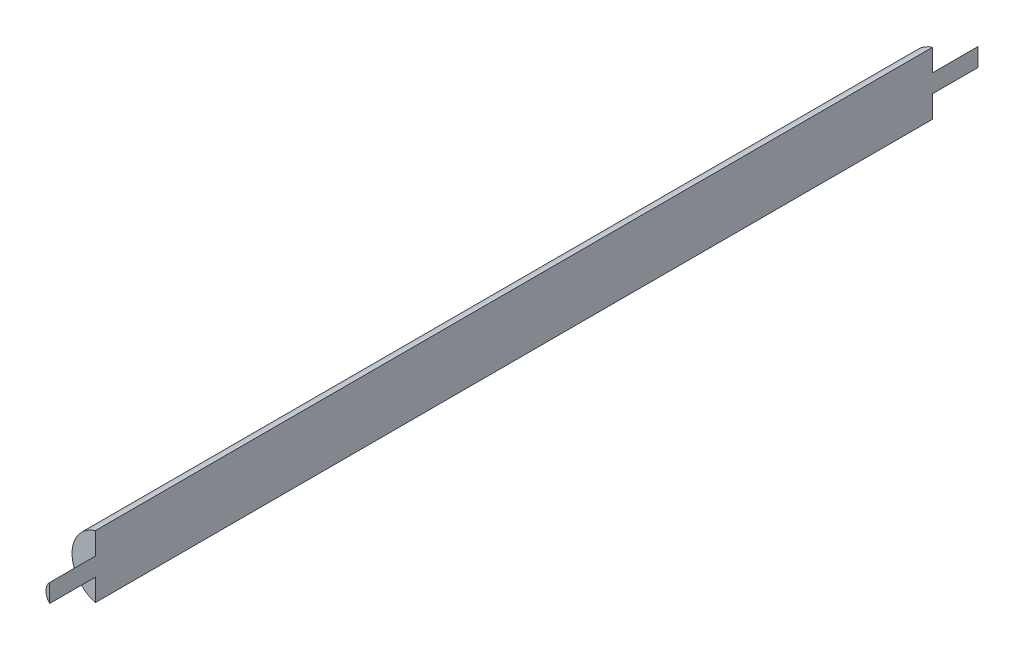
ISO-10303-21;
HEADER;
FILE_DESCRIPTION(('STEP AP214'),'2;1');
FILE_NAME('part.step','',(''),(''),'','','');
FILE_SCHEMA(('AUTOMOTIVE_DESIGN { 1 0 10303 214 1 1 1 1 }'));
ENDSEC;
DATA;
#1=APPLICATION_CONTEXT('core data for automotive mechanical design processes');
#2=APPLICATION_PROTOCOL_DEFINITION('international standard','automotive_design',2000,#1);
#3=PRODUCT_CONTEXT('',#1,'mechanical');
#4=PRODUCT('Part','Part','',(#3));
#5=PRODUCT_RELATED_PRODUCT_CATEGORY('part','',(#4));
#6=PRODUCT_DEFINITION_FORMATION('','',#4);
#7=PRODUCT_DEFINITION_CONTEXT('part definition',#1,'design');
#8=PRODUCT_DEFINITION('design','',#6,#7);
#9=PRODUCT_DEFINITION_SHAPE('','',#8);
#10=(LENGTH_UNIT() NAMED_UNIT(*) SI_UNIT(.MILLI.,.METRE.));
#11=(NAMED_UNIT(*) PLANE_ANGLE_UNIT() SI_UNIT($,.RADIAN.));
#12=(NAMED_UNIT(*) SI_UNIT($,.STERADIAN.) SOLID_ANGLE_UNIT());
#13=UNCERTAINTY_MEASURE_WITH_UNIT(LENGTH_MEASURE(1.E-05),#10,'distance_accuracy_value','');
#14=(GEOMETRIC_REPRESENTATION_CONTEXT(3) GLOBAL_UNCERTAINTY_ASSIGNED_CONTEXT((#13)) GLOBAL_UNIT_ASSIGNED_CONTEXT((#10,
#11,#12)) REPRESENTATION_CONTEXT('',''));
#15=CARTESIAN_POINT('',(0.,0.,0.));
#16=DIRECTION('',(0.,0.,1.));
#17=DIRECTION('',(1.,0.,0.));
#18=AXIS2_PLACEMENT_3D('',#15,#16,#17);
#19=CARTESIAN_POINT('',(0.,0.,90.));
#20=DIRECTION('',(0.,0.,-1.));
#21=DIRECTION('',(-1.,0.,0.));
#22=AXIS2_PLACEMENT_3D('',#19,#20,#21);
#23=CYLINDRICAL_SURFACE('',#22,3.5);
#24=CARTESIAN_POINT('',(0.,0.,90.));
#25=DIRECTION('',(0.,0.,1.));
#26=DIRECTION('',(1.,0.,0.));
#27=AXIS2_PLACEMENT_3D('',#24,#25,#26);
#28=CIRCLE('',#27,3.5);
#29=CARTESIAN_POINT('',(-1.,3.35410196624968,90.));
#30=VERTEX_POINT('',#29);
#31=CARTESIAN_POINT('',(-0.999999999999999,-3.35410196624968,90.));
#32=VERTEX_POINT('',#31);
#33=EDGE_CURVE('E110',#30,#32,#28,.T.);
#34=ORIENTED_EDGE('',*,*,#33,.F.);
#35=DIRECTION('',(0.,0.,-1.));
#36=VECTOR('',#35,1.);
#37=CARTESIAN_POINT('',(-1.,3.35410196624968,90.));
#38=LINE('',#37,#36);
#39=CARTESIAN_POINT('',(-1.,3.35410196624968,0.));
#40=VERTEX_POINT('',#39);
#41=EDGE_CURVE('E116',#30,#40,#38,.T.);
#42=ORIENTED_EDGE('',*,*,#41,.T.);
#43=CARTESIAN_POINT('',(0.,0.,0.));
#44=DIRECTION('',(0.,0.,1.));
#45=DIRECTION('',(1.,0.,0.));
#46=AXIS2_PLACEMENT_3D('',#43,#44,#45);
#47=CIRCLE('',#46,3.5);
#48=CARTESIAN_POINT('',(-0.999999999999999,-3.35410196624968,0.));
#49=VERTEX_POINT('',#48);
#50=EDGE_CURVE('E114',#40,#49,#47,.T.);
#51=ORIENTED_EDGE('',*,*,#50,.T.);
#52=DIRECTION('',(0.,0.,-1.));
#53=VECTOR('',#52,1.);
#54=CARTESIAN_POINT('',(-0.999999999999999,-3.35410196624968,90.));
#55=LINE('',#54,#53);
#56=EDGE_CURVE('E113',#49,#32,#55,.F.);
#57=ORIENTED_EDGE('',*,*,#56,.T.);
#58=EDGE_LOOP('',(#34,#42,#51,#57));
#59=FACE_BOUND('',#58,.T.);
#60=ADVANCED_FACE('F32',(#59),#23,.T.);
#61=CARTESIAN_POINT('',(0.,0.,90.));
#62=DIRECTION('',(0.,0.,1.));
#63=DIRECTION('',(1.,0.,0.));
#64=AXIS2_PLACEMENT_3D('',#61,#62,#63);
#65=PLANE('',#64);
#66=DIRECTION('',(0.,-1.,0.));
#67=VECTOR('',#66,1.);
#68=CARTESIAN_POINT('',(-1.,0.,90.));
#69=LINE('',#68,#67);
#70=CARTESIAN_POINT('',(-1.,0.979795897113271,90.));
#71=VERTEX_POINT('',#70);
#72=EDGE_CURVE('E41',#30,#71,#69,.T.);
#73=ORIENTED_EDGE('',*,*,#72,.F.);
#74=ORIENTED_EDGE('',*,*,#33,.T.);
#75=CARTESIAN_POINT('',(-0.999999999999999,-0.979795897113272,90.));
#76=VERTEX_POINT('',#75);
#77=EDGE_CURVE('E95',#76,#32,#69,.T.);
#78=ORIENTED_EDGE('',*,*,#77,.F.);
#79=CARTESIAN_POINT('',(0.,0.,90.));
#80=DIRECTION('',(0.,0.,1.));
#81=DIRECTION('',(1.,0.,0.));
#82=AXIS2_PLACEMENT_3D('',#79,#80,#81);
#83=CIRCLE('',#82,1.4);
#84=EDGE_CURVE('E106',#71,#76,#83,.T.);
#85=ORIENTED_EDGE('',*,*,#84,.F.);
#86=EDGE_LOOP('',(#73,#74,#78,#85));
#87=FACE_BOUND('',#86,.T.);
#88=ADVANCED_FACE('F137',(#87),#65,.T.);
#89=CARTESIAN_POINT('',(0.,0.,0.));
#90=DIRECTION('',(0.,0.,1.));
#91=DIRECTION('',(1.,0.,0.));
#92=AXIS2_PLACEMENT_3D('',#89,#90,#91);
#93=PLANE('',#92);
#94=ORIENTED_EDGE('',*,*,#50,.F.);
#95=DIRECTION('',(0.,-1.,0.));
#96=VECTOR('',#95,1.);
#97=CARTESIAN_POINT('',(-1.,0.,0.));
#98=LINE('',#97,#96);
#99=CARTESIAN_POINT('',(-1.,0.979795897113271,0.));
#100=VERTEX_POINT('',#99);
#101=EDGE_CURVE('E103',#40,#100,#98,.T.);
#102=ORIENTED_EDGE('',*,*,#101,.T.);
#103=CARTESIAN_POINT('',(0.,0.,0.));
#104=DIRECTION('',(0.,0.,-1.));
#105=DIRECTION('',(-1.,0.,0.));
#106=AXIS2_PLACEMENT_3D('',#103,#104,#105);
#107=CIRCLE('',#106,1.4);
#108=CARTESIAN_POINT('',(-0.999999999999999,-0.979795897113272,0.));
#109=VERTEX_POINT('',#108);
#110=EDGE_CURVE('E89',#109,#100,#107,.T.);
#111=ORIENTED_EDGE('',*,*,#110,.F.);
#112=EDGE_CURVE('E84',#109,#49,#98,.T.);
#113=ORIENTED_EDGE('',*,*,#112,.T.);
#114=EDGE_LOOP('',(#94,#102,#111,#113));
#115=FACE_BOUND('',#114,.T.);
#116=ADVANCED_FACE('F134',(#115),#93,.F.);
#117=CARTESIAN_POINT('',(0.,0.,94.9));
#118=DIRECTION('',(0.,0.,-1.));
#119=DIRECTION('',(-1.,0.,0.));
#120=AXIS2_PLACEMENT_3D('',#117,#118,#119);
#121=CYLINDRICAL_SURFACE('',#120,1.4);
#122=CARTESIAN_POINT('',(0.,0.,94.9));
#123=DIRECTION('',(0.,0.,1.));
#124=DIRECTION('',(1.,0.,0.));
#125=AXIS2_PLACEMENT_3D('',#122,#123,#124);
#126=CIRCLE('',#125,1.4);
#127=CARTESIAN_POINT('',(-1.,0.979795897113271,94.9));
#128=VERTEX_POINT('',#127);
#129=CARTESIAN_POINT('',(-0.999999999999999,-0.979795897113272,94.9));
#130=VERTEX_POINT('',#129);
#131=EDGE_CURVE('E90',#128,#130,#126,.T.);
#132=ORIENTED_EDGE('',*,*,#131,.F.);
#133=DIRECTION('',(0.,0.,-1.));
#134=VECTOR('',#133,1.);
#135=CARTESIAN_POINT('',(-1.,0.979795897113271,94.9));
#136=LINE('',#135,#134);
#137=EDGE_CURVE('E109',#128,#71,#136,.T.);
#138=ORIENTED_EDGE('',*,*,#137,.T.);
#139=ORIENTED_EDGE('',*,*,#84,.T.);
#140=DIRECTION('',(0.,0.,-1.));
#141=VECTOR('',#140,1.);
#142=CARTESIAN_POINT('',(-0.999999999999999,-0.979795897113272,94.9));
#143=LINE('',#142,#141);
#144=EDGE_CURVE('E49',#76,#130,#143,.F.);
#145=ORIENTED_EDGE('',*,*,#144,.T.);
#146=EDGE_LOOP('',(#132,#138,#139,#145));
#147=FACE_BOUND('',#146,.T.);
#148=ADVANCED_FACE('F136',(#147),#121,.T.);
#149=CARTESIAN_POINT('',(0.,0.,94.9));
#150=DIRECTION('',(0.,0.,1.));
#151=DIRECTION('',(1.,0.,0.));
#152=AXIS2_PLACEMENT_3D('',#149,#150,#151);
#153=PLANE('',#152);
#154=DIRECTION('',(0.,-1.,0.));
#155=VECTOR('',#154,1.);
#156=CARTESIAN_POINT('',(-1.,3.86835614548139,94.9));
#157=LINE('',#156,#155);
#158=EDGE_CURVE('E11',#128,#130,#157,.T.);
#159=ORIENTED_EDGE('',*,*,#158,.F.);
#160=ORIENTED_EDGE('',*,*,#131,.T.);
#161=EDGE_LOOP('',(#159,#160));
#162=FACE_BOUND('',#161,.T.);
#163=ADVANCED_FACE('F143',(#162),#153,.T.);
#164=CARTESIAN_POINT('',(0.,0.,-4.9));
#165=DIRECTION('',(0.,0.,1.));
#166=DIRECTION('',(1.,0.,0.));
#167=AXIS2_PLACEMENT_3D('',#164,#165,#166);
#168=CYLINDRICAL_SURFACE('',#167,1.4);
#169=CARTESIAN_POINT('',(0.,0.,-4.9));
#170=DIRECTION('',(0.,0.,-1.));
#171=DIRECTION('',(-1.,0.,0.));
#172=AXIS2_PLACEMENT_3D('',#169,#170,#171);
#173=CIRCLE('',#172,1.4);
#174=CARTESIAN_POINT('',(-0.999999999999999,-0.979795897113272,-4.9));
#175=VERTEX_POINT('',#174);
#176=CARTESIAN_POINT('',(-1.,0.979795897113271,-4.9));
#177=VERTEX_POINT('',#176);
#178=EDGE_CURVE('E35',#175,#177,#173,.T.);
#179=ORIENTED_EDGE('',*,*,#178,.F.);
#180=DIRECTION('',(0.,0.,1.));
#181=VECTOR('',#180,1.);
#182=CARTESIAN_POINT('',(-0.999999999999999,-0.979795897113272,-4.9));
#183=LINE('',#182,#181);
#184=EDGE_CURVE('E81',#175,#109,#183,.T.);
#185=ORIENTED_EDGE('',*,*,#184,.T.);
#186=ORIENTED_EDGE('',*,*,#110,.T.);
#187=DIRECTION('',(0.,0.,1.));
#188=VECTOR('',#187,1.);
#189=CARTESIAN_POINT('',(-1.,0.979795897113271,-4.9));
#190=LINE('',#189,#188);
#191=EDGE_CURVE('E98',#100,#177,#190,.F.);
#192=ORIENTED_EDGE('',*,*,#191,.T.);
#193=EDGE_LOOP('',(#179,#185,#186,#192));
#194=FACE_BOUND('',#193,.T.);
#195=ADVANCED_FACE('F97',(#194),#168,.T.);
#196=CARTESIAN_POINT('',(0.,0.,-4.9));
#197=DIRECTION('',(0.,0.,-1.));
#198=DIRECTION('',(-1.,0.,0.));
#199=AXIS2_PLACEMENT_3D('',#196,#197,#198);
#200=PLANE('',#199);
#201=DIRECTION('',(0.,1.,0.));
#202=VECTOR('',#201,1.);
#203=CARTESIAN_POINT('',(-1.,0.,-4.9));
#204=LINE('',#203,#202);
#205=EDGE_CURVE('E78',#175,#177,#204,.T.);
#206=ORIENTED_EDGE('',*,*,#205,.F.);
#207=ORIENTED_EDGE('',*,*,#178,.T.);
#208=EDGE_LOOP('',(#206,#207));
#209=FACE_BOUND('',#208,.T.);
#210=ADVANCED_FACE('F94',(#209),#200,.T.);
#211=CARTESIAN_POINT('',(-1.,3.86835614548139,-4.9));
#212=DIRECTION('',(-1.,0.,0.));
#213=DIRECTION('',(0.,-1.,0.));
#214=AXIS2_PLACEMENT_3D('',#211,#212,#213);
#215=PLANE('',#214);
#216=ORIENTED_EDGE('',*,*,#77,.T.);
#217=ORIENTED_EDGE('',*,*,#56,.F.);
#218=ORIENTED_EDGE('',*,*,#112,.F.);
#219=ORIENTED_EDGE('',*,*,#184,.F.);
#220=ORIENTED_EDGE('',*,*,#205,.T.);
#221=ORIENTED_EDGE('',*,*,#191,.F.);
#222=ORIENTED_EDGE('',*,*,#101,.F.);
#223=ORIENTED_EDGE('',*,*,#41,.F.);
#224=ORIENTED_EDGE('',*,*,#72,.T.);
#225=ORIENTED_EDGE('',*,*,#137,.F.);
#226=ORIENTED_EDGE('',*,*,#158,.T.);
#227=ORIENTED_EDGE('',*,*,#144,.F.);
#228=EDGE_LOOP('',(#216,#217,#218,#219,#220,#221,#222,#223,#224,#225,#226,#227));
#229=FACE_BOUND('',#228,.T.);
#230=ADVANCED_FACE('F82',(#229),#215,.F.);
#231=CLOSED_SHELL('',(#60,#88,#116,#148,#163,#195,#210,#230));
#232=MANIFOLD_SOLID_BREP('B2',#231);
#233=ADVANCED_BREP_SHAPE_REPRESENTATION('',(#18,#232),#14);
#234=SHAPE_DEFINITION_REPRESENTATION(#9,#233);
ENDSEC;
END-ISO-10303-21;
